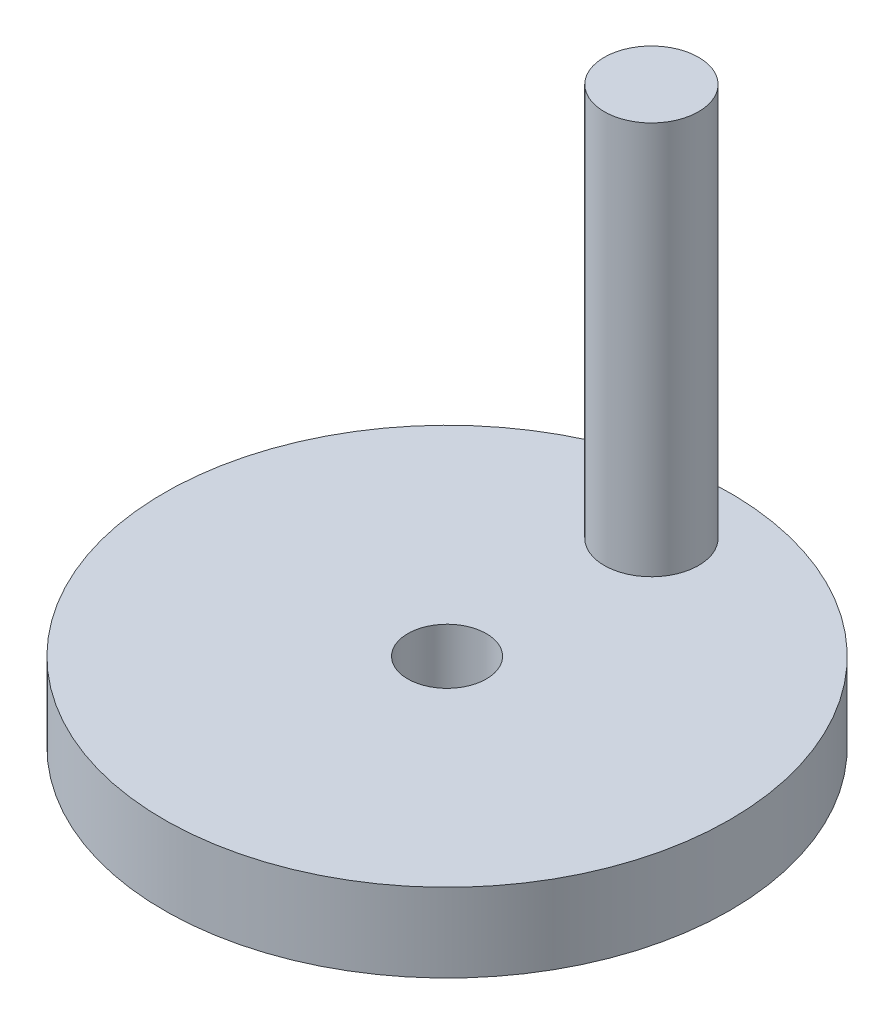
ISO-10303-21;
HEADER;
FILE_DESCRIPTION(('STEP AP214'),'2;1');
FILE_NAME('part.step','',(''),(''),'','','');
FILE_SCHEMA(('AUTOMOTIVE_DESIGN { 1 0 10303 214 1 1 1 1 }'));
ENDSEC;
DATA;
#1=APPLICATION_CONTEXT('core data for automotive mechanical design processes');
#2=APPLICATION_PROTOCOL_DEFINITION('international standard','automotive_design',2000,#1);
#3=PRODUCT_CONTEXT('',#1,'mechanical');
#4=PRODUCT('Part','Part','',(#3));
#5=PRODUCT_RELATED_PRODUCT_CATEGORY('part','',(#4));
#6=PRODUCT_DEFINITION_FORMATION('','',#4);
#7=PRODUCT_DEFINITION_CONTEXT('part definition',#1,'design');
#8=PRODUCT_DEFINITION('design','',#6,#7);
#9=PRODUCT_DEFINITION_SHAPE('','',#8);
#10=(LENGTH_UNIT() NAMED_UNIT(*) SI_UNIT(.MILLI.,.METRE.));
#11=(NAMED_UNIT(*) PLANE_ANGLE_UNIT() SI_UNIT($,.RADIAN.));
#12=(NAMED_UNIT(*) SI_UNIT($,.STERADIAN.) SOLID_ANGLE_UNIT());
#13=UNCERTAINTY_MEASURE_WITH_UNIT(LENGTH_MEASURE(1.E-05),#10,'distance_accuracy_value','');
#14=(GEOMETRIC_REPRESENTATION_CONTEXT(3) GLOBAL_UNCERTAINTY_ASSIGNED_CONTEXT((#13)) GLOBAL_UNIT_ASSIGNED_CONTEXT((#10,
#11,#12)) REPRESENTATION_CONTEXT('',''));
#15=CARTESIAN_POINT('',(0.,0.,0.));
#16=DIRECTION('',(0.,0.,1.));
#17=DIRECTION('',(1.,0.,0.));
#18=AXIS2_PLACEMENT_3D('',#15,#16,#17);
#19=CARTESIAN_POINT('',(0.,5.,0.));
#20=DIRECTION('',(0.,-1.,0.));
#21=DIRECTION('',(1.,0.,0.));
#22=AXIS2_PLACEMENT_3D('',#19,#20,#21);
#23=CYLINDRICAL_SURFACE('',#22,6.);
#24=CARTESIAN_POINT('',(0.,5.,0.));
#25=DIRECTION('',(0.,-1.,0.));
#26=DIRECTION('',(1.,0.,0.));
#27=AXIS2_PLACEMENT_3D('',#24,#25,#26);
#28=CIRCLE('',#27,6.);
#29=CARTESIAN_POINT('',(6.,5.,0.));
#30=VERTEX_POINT('',#29);
#31=EDGE_CURVE('E38',#30,#30,#28,.T.);
#32=ORIENTED_EDGE('',*,*,#31,.T.);
#33=EDGE_LOOP('',(#32));
#34=FACE_BOUND('',#33,.T.);
#35=CARTESIAN_POINT('',(0.,0.,0.));
#36=DIRECTION('',(0.,-1.,0.));
#37=DIRECTION('',(1.,0.,0.));
#38=AXIS2_PLACEMENT_3D('',#35,#36,#37);
#39=CIRCLE('',#38,6.);
#40=CARTESIAN_POINT('',(6.,0.,0.));
#41=VERTEX_POINT('',#40);
#42=EDGE_CURVE('E121',#41,#41,#39,.F.);
#43=ORIENTED_EDGE('',*,*,#42,.T.);
#44=EDGE_LOOP('',(#43));
#45=FACE_BOUND('',#44,.T.);
#46=ADVANCED_FACE('F34',(#34,#45),#23,.T.);
#47=CARTESIAN_POINT('',(-18.216,5.,-18.216));
#48=DIRECTION('',(0.,1.,0.));
#49=DIRECTION('',(0.,0.,1.));
#50=AXIS2_PLACEMENT_3D('',#47,#48,#49);
#51=PLANE('',#50);
#52=ORIENTED_EDGE('',*,*,#31,.F.);
#53=EDGE_LOOP('',(#52));
#54=FACE_BOUND('',#53,.T.);
#55=CARTESIAN_POINT('',(0.,5.,0.));
#56=DIRECTION('',(0.,-1.,0.));
#57=DIRECTION('',(1.,0.,0.));
#58=AXIS2_PLACEMENT_3D('',#55,#56,#57);
#59=CIRCLE('',#58,18.);
#60=CARTESIAN_POINT('',(18.,5.,0.));
#61=VERTEX_POINT('',#60);
#62=EDGE_CURVE('E119',#61,#61,#59,.T.);
#63=ORIENTED_EDGE('',*,*,#62,.T.);
#64=EDGE_LOOP('',(#63));
#65=FACE_BOUND('',#64,.T.);
#66=ADVANCED_FACE('F129',(#54,#65),#51,.F.);
#67=CARTESIAN_POINT('',(-6.072,0.,-6.072));
#68=DIRECTION('',(0.,1.,0.));
#69=DIRECTION('',(0.,0.,1.));
#70=AXIS2_PLACEMENT_3D('',#67,#68,#69);
#71=PLANE('',#70);
#72=DIRECTION('',(-1.,0.,0.));
#73=VECTOR('',#72,1.);
#74=CARTESIAN_POINT('',(-1.,0.,4.));
#75=LINE('',#74,#73);
#76=CARTESIAN_POINT('',(1.,0.,4.));
#77=VERTEX_POINT('',#76);
#78=CARTESIAN_POINT('',(-1.,0.,4.));
#79=VERTEX_POINT('',#78);
#80=EDGE_CURVE('E96',#77,#79,#75,.T.);
#81=ORIENTED_EDGE('',*,*,#80,.F.);
#82=DIRECTION('',(0.,0.,1.));
#83=VECTOR('',#82,1.);
#84=CARTESIAN_POINT('',(1.,0.,2.29128784747792));
#85=LINE('',#84,#83);
#86=CARTESIAN_POINT('',(1.,0.,2.29128784747792));
#87=VERTEX_POINT('',#86);
#88=EDGE_CURVE('E82',#87,#77,#85,.T.);
#89=ORIENTED_EDGE('',*,*,#88,.F.);
#90=CARTESIAN_POINT('',(0.,0.,0.));
#91=DIRECTION('',(0.,-1.,0.));
#92=DIRECTION('',(1.,0.,0.));
#93=AXIS2_PLACEMENT_3D('',#90,#91,#92);
#94=CIRCLE('',#93,2.5);
#95=CARTESIAN_POINT('',(-1.,0.,2.29128784747792));
#96=VERTEX_POINT('',#95);
#97=EDGE_CURVE('E116',#96,#87,#94,.T.);
#98=ORIENTED_EDGE('',*,*,#97,.F.);
#99=DIRECTION('',(0.,0.,-1.));
#100=VECTOR('',#99,1.);
#101=CARTESIAN_POINT('',(-1.,0.,2.29128784747792));
#102=LINE('',#101,#100);
#103=EDGE_CURVE('E94',#79,#96,#102,.T.);
#104=ORIENTED_EDGE('',*,*,#103,.F.);
#105=EDGE_LOOP('',(#81,#89,#98,#104));
#106=FACE_BOUND('',#105,.T.);
#107=ORIENTED_EDGE('',*,*,#42,.F.);
#108=EDGE_LOOP('',(#107));
#109=FACE_BOUND('',#108,.T.);
#110=ADVANCED_FACE('F132',(#106,#109),#71,.F.);
#111=CARTESIAN_POINT('',(0.,10.,0.));
#112=DIRECTION('',(0.,-1.,0.));
#113=DIRECTION('',(1.,0.,0.));
#114=AXIS2_PLACEMENT_3D('',#111,#112,#113);
#115=CYLINDRICAL_SURFACE('',#114,18.);
#116=ORIENTED_EDGE('',*,*,#62,.F.);
#117=EDGE_LOOP('',(#116));
#118=FACE_BOUND('',#117,.T.);
#119=CARTESIAN_POINT('',(0.,10.,0.));
#120=DIRECTION('',(0.,-1.,0.));
#121=DIRECTION('',(1.,0.,0.));
#122=AXIS2_PLACEMENT_3D('',#119,#120,#121);
#123=CIRCLE('',#122,18.);
#124=CARTESIAN_POINT('',(18.,10.,0.));
#125=VERTEX_POINT('',#124);
#126=EDGE_CURVE('E113',#125,#125,#123,.F.);
#127=ORIENTED_EDGE('',*,*,#126,.F.);
#128=EDGE_LOOP('',(#127));
#129=FACE_BOUND('',#128,.T.);
#130=ADVANCED_FACE('F136',(#118,#129),#115,.T.);
#131=CARTESIAN_POINT('',(0.,10.,0.));
#132=DIRECTION('',(0.,-1.,0.));
#133=DIRECTION('',(1.,0.,0.));
#134=AXIS2_PLACEMENT_3D('',#131,#132,#133);
#135=CYLINDRICAL_SURFACE('',#134,2.5);
#136=DIRECTION('',(0.,-1.,0.));
#137=VECTOR('',#136,1.);
#138=CARTESIAN_POINT('',(1.,5.,2.29128784747792));
#139=LINE('',#138,#137);
#140=CARTESIAN_POINT('',(1.,5.,2.29128784747792));
#141=VERTEX_POINT('',#140);
#142=EDGE_CURVE('E77',#141,#87,#139,.T.);
#143=ORIENTED_EDGE('',*,*,#142,.F.);
#144=CARTESIAN_POINT('',(0.,5.,0.));
#145=DIRECTION('',(0.,1.,0.));
#146=DIRECTION('',(0.,0.,-1.));
#147=AXIS2_PLACEMENT_3D('',#144,#145,#146);
#148=CIRCLE('',#147,2.5);
#149=CARTESIAN_POINT('',(-1.,5.,2.29128784747792));
#150=VERTEX_POINT('',#149);
#151=EDGE_CURVE('E87',#150,#141,#148,.T.);
#152=ORIENTED_EDGE('',*,*,#151,.F.);
#153=DIRECTION('',(0.,-1.,0.));
#154=VECTOR('',#153,1.);
#155=CARTESIAN_POINT('',(-1.,5.,2.29128784747792));
#156=LINE('',#155,#154);
#157=EDGE_CURVE('E104',#150,#96,#156,.T.);
#158=ORIENTED_EDGE('',*,*,#157,.T.);
#159=ORIENTED_EDGE('',*,*,#97,.T.);
#160=EDGE_LOOP('',(#143,#152,#158,#159));
#161=FACE_BOUND('',#160,.T.);
#162=CARTESIAN_POINT('',(0.,10.,0.));
#163=DIRECTION('',(0.,-1.,0.));
#164=DIRECTION('',(1.,0.,0.));
#165=AXIS2_PLACEMENT_3D('',#162,#163,#164);
#166=CIRCLE('',#165,2.5);
#167=CARTESIAN_POINT('',(2.5,10.,0.));
#168=VERTEX_POINT('',#167);
#169=EDGE_CURVE('E110',#168,#168,#166,.T.);
#170=ORIENTED_EDGE('',*,*,#169,.F.);
#171=EDGE_LOOP('',(#170));
#172=FACE_BOUND('',#171,.T.);
#173=ADVANCED_FACE('F139',(#161,#172),#135,.F.);
#174=CARTESIAN_POINT('',(-18.216,10.,-18.216));
#175=DIRECTION('',(0.,1.,0.));
#176=DIRECTION('',(0.,0.,1.));
#177=AXIS2_PLACEMENT_3D('',#174,#175,#176);
#178=PLANE('',#177);
#179=CARTESIAN_POINT('',(0.,10.,-13.));
#180=DIRECTION('',(0.,-1.,0.));
#181=DIRECTION('',(0.,0.,-1.));
#182=AXIS2_PLACEMENT_3D('',#179,#180,#181);
#183=CIRCLE('',#182,3.);
#184=CARTESIAN_POINT('',(0.,10.,-16.));
#185=VERTEX_POINT('',#184);
#186=EDGE_CURVE('E43',#185,#185,#183,.T.);
#187=ORIENTED_EDGE('',*,*,#186,.T.);
#188=EDGE_LOOP('',(#187));
#189=FACE_BOUND('',#188,.T.);
#190=ORIENTED_EDGE('',*,*,#169,.T.);
#191=EDGE_LOOP('',(#190));
#192=FACE_BOUND('',#191,.T.);
#193=ORIENTED_EDGE('',*,*,#126,.T.);
#194=EDGE_LOOP('',(#193));
#195=FACE_BOUND('',#194,.T.);
#196=ADVANCED_FACE('F143',(#189,#192,#195),#178,.T.);
#197=CARTESIAN_POINT('',(-3.036,35.,-16.036));
#198=DIRECTION('',(0.,1.,0.));
#199=DIRECTION('',(0.,0.,1.));
#200=AXIS2_PLACEMENT_3D('',#197,#198,#199);
#201=PLANE('',#200);
#202=CARTESIAN_POINT('',(0.,35.,-13.));
#203=DIRECTION('',(0.,-1.,0.));
#204=DIRECTION('',(0.,0.,-1.));
#205=AXIS2_PLACEMENT_3D('',#202,#203,#204);
#206=CIRCLE('',#205,3.);
#207=CARTESIAN_POINT('',(0.,35.,-16.));
#208=VERTEX_POINT('',#207);
#209=EDGE_CURVE('E11',#208,#208,#206,.F.);
#210=ORIENTED_EDGE('',*,*,#209,.T.);
#211=EDGE_LOOP('',(#210));
#212=FACE_BOUND('',#211,.T.);
#213=ADVANCED_FACE('F36',(#212),#201,.T.);
#214=CARTESIAN_POINT('',(0.,35.,-13.));
#215=DIRECTION('',(0.,-1.,0.));
#216=DIRECTION('',(0.,0.,-1.));
#217=AXIS2_PLACEMENT_3D('',#214,#215,#216);
#218=CYLINDRICAL_SURFACE('',#217,3.);
#219=ORIENTED_EDGE('',*,*,#186,.F.);
#220=EDGE_LOOP('',(#219));
#221=FACE_BOUND('',#220,.T.);
#222=ORIENTED_EDGE('',*,*,#209,.F.);
#223=EDGE_LOOP('',(#222));
#224=FACE_BOUND('',#223,.T.);
#225=ADVANCED_FACE('F150',(#221,#224),#218,.T.);
#226=CARTESIAN_POINT('',(1.,5.,2.29128784747792));
#227=DIRECTION('',(1.,0.,0.));
#228=DIRECTION('',(0.,0.,-1.));
#229=AXIS2_PLACEMENT_3D('',#226,#227,#228);
#230=PLANE('',#229);
#231=ORIENTED_EDGE('',*,*,#88,.T.);
#232=DIRECTION('',(0.,-1.,0.));
#233=VECTOR('',#232,1.);
#234=CARTESIAN_POINT('',(1.,5.,4.));
#235=LINE('',#234,#233);
#236=CARTESIAN_POINT('',(1.,5.,4.));
#237=VERTEX_POINT('',#236);
#238=EDGE_CURVE('E79',#237,#77,#235,.T.);
#239=ORIENTED_EDGE('',*,*,#238,.F.);
#240=DIRECTION('',(0.,0.,1.));
#241=VECTOR('',#240,1.);
#242=CARTESIAN_POINT('',(1.,5.,2.29128784747792));
#243=LINE('',#242,#241);
#244=EDGE_CURVE('E60',#141,#237,#243,.T.);
#245=ORIENTED_EDGE('',*,*,#244,.F.);
#246=ORIENTED_EDGE('',*,*,#142,.T.);
#247=EDGE_LOOP('',(#231,#239,#245,#246));
#248=FACE_BOUND('',#247,.T.);
#249=ADVANCED_FACE('F81',(#248),#230,.F.);
#250=CARTESIAN_POINT('',(-1.,5.,2.29128784747792));
#251=DIRECTION('',(-1.,0.,0.));
#252=DIRECTION('',(0.,0.,1.));
#253=AXIS2_PLACEMENT_3D('',#250,#251,#252);
#254=PLANE('',#253);
#255=ORIENTED_EDGE('',*,*,#103,.T.);
#256=ORIENTED_EDGE('',*,*,#157,.F.);
#257=DIRECTION('',(0.,0.,-1.));
#258=VECTOR('',#257,1.);
#259=CARTESIAN_POINT('',(-1.,5.,2.29128784747792));
#260=LINE('',#259,#258);
#261=CARTESIAN_POINT('',(-1.,5.,4.));
#262=VERTEX_POINT('',#261);
#263=EDGE_CURVE('E51',#262,#150,#260,.T.);
#264=ORIENTED_EDGE('',*,*,#263,.F.);
#265=DIRECTION('',(0.,-1.,0.));
#266=VECTOR('',#265,1.);
#267=CARTESIAN_POINT('',(-1.,5.,4.));
#268=LINE('',#267,#266);
#269=EDGE_CURVE('E86',#262,#79,#268,.T.);
#270=ORIENTED_EDGE('',*,*,#269,.T.);
#271=EDGE_LOOP('',(#255,#256,#264,#270));
#272=FACE_BOUND('',#271,.T.);
#273=ADVANCED_FACE('F162',(#272),#254,.F.);
#274=CARTESIAN_POINT('',(-1.,5.,4.));
#275=DIRECTION('',(0.,0.,1.));
#276=DIRECTION('',(1.,0.,0.));
#277=AXIS2_PLACEMENT_3D('',#274,#275,#276);
#278=PLANE('',#277);
#279=ORIENTED_EDGE('',*,*,#80,.T.);
#280=ORIENTED_EDGE('',*,*,#269,.F.);
#281=DIRECTION('',(-1.,0.,0.));
#282=VECTOR('',#281,1.);
#283=CARTESIAN_POINT('',(-1.,5.,4.));
#284=LINE('',#283,#282);
#285=EDGE_CURVE('E89',#237,#262,#284,.T.);
#286=ORIENTED_EDGE('',*,*,#285,.F.);
#287=ORIENTED_EDGE('',*,*,#238,.T.);
#288=EDGE_LOOP('',(#279,#280,#286,#287));
#289=FACE_BOUND('',#288,.T.);
#290=ADVANCED_FACE('F90',(#289),#278,.F.);
#291=CARTESIAN_POINT('',(0.,5.,0.));
#292=DIRECTION('',(0.,-1.,0.));
#293=DIRECTION('',(0.,0.,-1.));
#294=AXIS2_PLACEMENT_3D('',#291,#292,#293);
#295=PLANE('',#294);
#296=ORIENTED_EDGE('',*,*,#244,.T.);
#297=ORIENTED_EDGE('',*,*,#285,.T.);
#298=ORIENTED_EDGE('',*,*,#263,.T.);
#299=ORIENTED_EDGE('',*,*,#151,.T.);
#300=EDGE_LOOP('',(#296,#297,#298,#299));
#301=FACE_BOUND('',#300,.T.);
#302=ADVANCED_FACE('F92',(#301),#295,.T.);
#303=CLOSED_SHELL('',(#46,#66,#110,#130,#173,#196,#213,#225,#249,#273,#290,#302));
#304=MANIFOLD_SOLID_BREP('B2',#303);
#305=ADVANCED_BREP_SHAPE_REPRESENTATION('',(#18,#304),#14);
#306=SHAPE_DEFINITION_REPRESENTATION(#9,#305);
ENDSEC;
END-ISO-10303-21;
